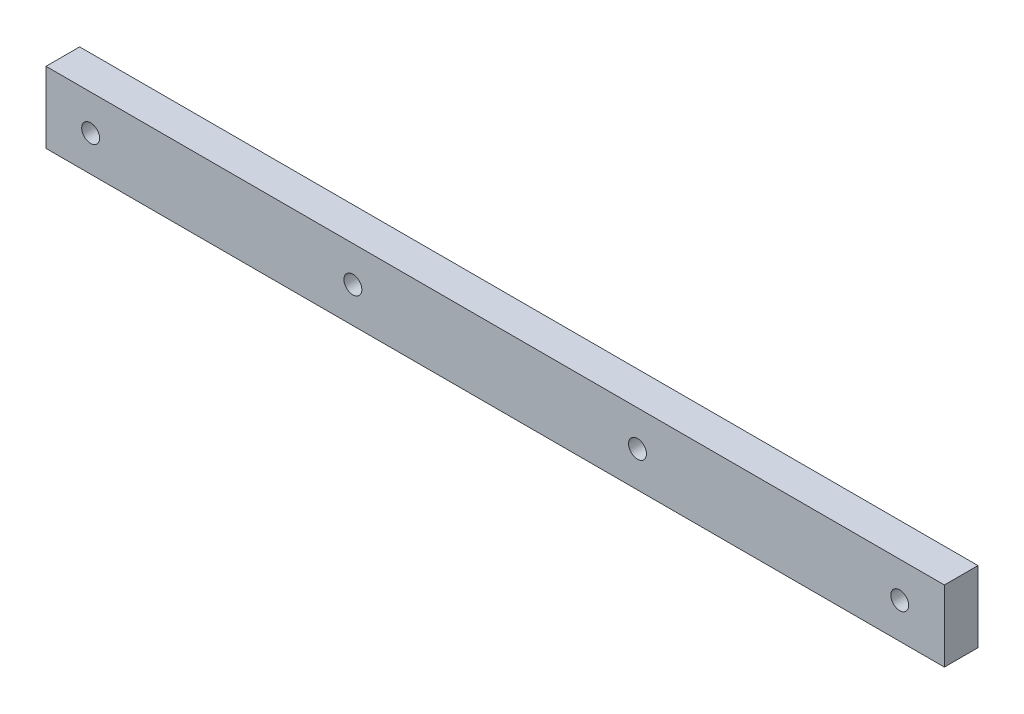
ISO-10303-21;
HEADER;
FILE_DESCRIPTION(('STEP AP214'),'2;1');
FILE_NAME('part.step','',(''),(''),'','','');
FILE_SCHEMA(('AUTOMOTIVE_DESIGN { 1 0 10303 214 1 1 1 1 }'));
ENDSEC;
DATA;
#1=APPLICATION_CONTEXT('core data for automotive mechanical design processes');
#2=APPLICATION_PROTOCOL_DEFINITION('international standard','automotive_design',2000,#1);
#3=PRODUCT_CONTEXT('',#1,'mechanical');
#4=PRODUCT('Part','Part','',(#3));
#5=PRODUCT_RELATED_PRODUCT_CATEGORY('part','',(#4));
#6=PRODUCT_DEFINITION_FORMATION('','',#4);
#7=PRODUCT_DEFINITION_CONTEXT('part definition',#1,'design');
#8=PRODUCT_DEFINITION('design','',#6,#7);
#9=PRODUCT_DEFINITION_SHAPE('','',#8);
#10=(LENGTH_UNIT() NAMED_UNIT(*) SI_UNIT(.MILLI.,.METRE.));
#11=(NAMED_UNIT(*) PLANE_ANGLE_UNIT() SI_UNIT($,.RADIAN.));
#12=(NAMED_UNIT(*) SI_UNIT($,.STERADIAN.) SOLID_ANGLE_UNIT());
#13=UNCERTAINTY_MEASURE_WITH_UNIT(LENGTH_MEASURE(1.E-05),#10,'distance_accuracy_value','');
#14=(GEOMETRIC_REPRESENTATION_CONTEXT(3) GLOBAL_UNCERTAINTY_ASSIGNED_CONTEXT((#13)) GLOBAL_UNIT_ASSIGNED_CONTEXT((#10,
#11,#12)) REPRESENTATION_CONTEXT('',''));
#15=CARTESIAN_POINT('',(0.,0.,0.));
#16=DIRECTION('',(0.,0.,1.));
#17=DIRECTION('',(1.,0.,0.));
#18=AXIS2_PLACEMENT_3D('',#15,#16,#17);
#19=CARTESIAN_POINT('',(0.,0.,6.));
#20=DIRECTION('',(0.,0.,1.));
#21=DIRECTION('',(1.,0.,0.));
#22=AXIS2_PLACEMENT_3D('',#19,#20,#21);
#23=PLANE('',#22);
#24=CARTESIAN_POINT('',(-25.4,6.35,6.));
#25=DIRECTION('',(0.,0.,1.));
#26=DIRECTION('',(1.,0.,0.));
#27=AXIS2_PLACEMENT_3D('',#24,#25,#26);
#28=CIRCLE('',#27,1.6);
#29=CARTESIAN_POINT('',(-23.8,6.35,6.));
#30=VERTEX_POINT('',#29);
#31=EDGE_CURVE('E130',#30,#30,#28,.T.);
#32=ORIENTED_EDGE('',*,*,#31,.F.);
#33=EDGE_LOOP('',(#32));
#34=FACE_BOUND('',#33,.T.);
#35=CARTESIAN_POINT('',(-72.2,6.35,6.));
#36=DIRECTION('',(0.,0.,1.));
#37=DIRECTION('',(1.,0.,0.));
#38=AXIS2_PLACEMENT_3D('',#35,#36,#37);
#39=CIRCLE('',#38,1.6);
#40=CARTESIAN_POINT('',(-70.6,6.35,6.));
#41=VERTEX_POINT('',#40);
#42=EDGE_CURVE('E106',#41,#41,#39,.T.);
#43=ORIENTED_EDGE('',*,*,#42,.F.);
#44=EDGE_LOOP('',(#43));
#45=FACE_BOUND('',#44,.T.);
#46=DIRECTION('',(0.,-1.,0.));
#47=VECTOR('',#46,1.);
#48=CARTESIAN_POINT('',(-80.17,12.7,6.));
#49=LINE('',#48,#47);
#50=CARTESIAN_POINT('',(-80.17,12.7,6.));
#51=VERTEX_POINT('',#50);
#52=CARTESIAN_POINT('',(-80.17,0.,6.));
#53=VERTEX_POINT('',#52);
#54=EDGE_CURVE('E93',#51,#53,#49,.T.);
#55=ORIENTED_EDGE('',*,*,#54,.T.);
#56=DIRECTION('',(1.,0.,0.));
#57=VECTOR('',#56,1.);
#58=CARTESIAN_POINT('',(-80.17,0.,6.));
#59=LINE('',#58,#57);
#60=CARTESIAN_POINT('',(80.17,0.,6.));
#61=VERTEX_POINT('',#60);
#62=EDGE_CURVE('E88',#53,#61,#59,.T.);
#63=ORIENTED_EDGE('',*,*,#62,.T.);
#64=DIRECTION('',(0.,1.,0.));
#65=VECTOR('',#64,1.);
#66=CARTESIAN_POINT('',(80.17,0.,6.));
#67=LINE('',#66,#65);
#68=CARTESIAN_POINT('',(80.17,12.7,6.));
#69=VERTEX_POINT('',#68);
#70=EDGE_CURVE('E90',#61,#69,#67,.T.);
#71=ORIENTED_EDGE('',*,*,#70,.T.);
#72=DIRECTION('',(-1.,0.,0.));
#73=VECTOR('',#72,1.);
#74=CARTESIAN_POINT('',(80.17,12.7,6.));
#75=LINE('',#74,#73);
#76=EDGE_CURVE('E57',#69,#51,#75,.T.);
#77=ORIENTED_EDGE('',*,*,#76,.T.);
#78=EDGE_LOOP('',(#55,#63,#71,#77));
#79=FACE_BOUND('',#78,.T.);
#80=CARTESIAN_POINT('',(72.2,6.35,6.));
#81=DIRECTION('',(0.,0.,1.));
#82=DIRECTION('',(1.,0.,0.));
#83=AXIS2_PLACEMENT_3D('',#80,#81,#82);
#84=CIRCLE('',#83,1.6);
#85=CARTESIAN_POINT('',(73.8,6.35,6.));
#86=VERTEX_POINT('',#85);
#87=EDGE_CURVE('E121',#86,#86,#84,.T.);
#88=ORIENTED_EDGE('',*,*,#87,.F.);
#89=EDGE_LOOP('',(#88));
#90=FACE_BOUND('',#89,.T.);
#91=CARTESIAN_POINT('',(25.4,6.35,6.));
#92=DIRECTION('',(0.,0.,1.));
#93=DIRECTION('',(1.,0.,0.));
#94=AXIS2_PLACEMENT_3D('',#91,#92,#93);
#95=CIRCLE('',#94,1.6);
#96=CARTESIAN_POINT('',(27.,6.35,6.));
#97=VERTEX_POINT('',#96);
#98=EDGE_CURVE('E134',#97,#97,#95,.T.);
#99=ORIENTED_EDGE('',*,*,#98,.F.);
#100=EDGE_LOOP('',(#99));
#101=FACE_BOUND('',#100,.T.);
#102=ADVANCED_FACE('F39',(#34,#45,#79,#90,#101),#23,.T.);
#103=CARTESIAN_POINT('',(0.,0.,0.));
#104=DIRECTION('',(0.,0.,1.));
#105=DIRECTION('',(1.,0.,0.));
#106=AXIS2_PLACEMENT_3D('',#103,#104,#105);
#107=PLANE('',#106);
#108=DIRECTION('',(0.,-1.,0.));
#109=VECTOR('',#108,1.);
#110=CARTESIAN_POINT('',(-80.17,12.7,0.));
#111=LINE('',#110,#109);
#112=CARTESIAN_POINT('',(-80.17,12.7,0.));
#113=VERTEX_POINT('',#112);
#114=CARTESIAN_POINT('',(-80.17,0.,0.));
#115=VERTEX_POINT('',#114);
#116=EDGE_CURVE('E103',#113,#115,#111,.T.);
#117=ORIENTED_EDGE('',*,*,#116,.F.);
#118=DIRECTION('',(-1.,0.,0.));
#119=VECTOR('',#118,1.);
#120=CARTESIAN_POINT('',(80.17,12.7,0.));
#121=LINE('',#120,#119);
#122=CARTESIAN_POINT('',(80.17,12.7,0.));
#123=VERTEX_POINT('',#122);
#124=EDGE_CURVE('E76',#123,#113,#121,.T.);
#125=ORIENTED_EDGE('',*,*,#124,.F.);
#126=DIRECTION('',(0.,1.,0.));
#127=VECTOR('',#126,1.);
#128=CARTESIAN_POINT('',(80.17,0.,0.));
#129=LINE('',#128,#127);
#130=CARTESIAN_POINT('',(80.17,0.,0.));
#131=VERTEX_POINT('',#130);
#132=EDGE_CURVE('E71',#131,#123,#129,.T.);
#133=ORIENTED_EDGE('',*,*,#132,.F.);
#134=DIRECTION('',(1.,0.,0.));
#135=VECTOR('',#134,1.);
#136=CARTESIAN_POINT('',(-80.17,0.,0.));
#137=LINE('',#136,#135);
#138=EDGE_CURVE('E92',#115,#131,#137,.T.);
#139=ORIENTED_EDGE('',*,*,#138,.F.);
#140=EDGE_LOOP('',(#117,#125,#133,#139));
#141=FACE_BOUND('',#140,.T.);
#142=CARTESIAN_POINT('',(-72.2,6.35,0.));
#143=DIRECTION('',(0.,0.,1.));
#144=DIRECTION('',(1.,0.,0.));
#145=AXIS2_PLACEMENT_3D('',#142,#143,#144);
#146=CIRCLE('',#145,1.6);
#147=CARTESIAN_POINT('',(-70.6,6.35,0.));
#148=VERTEX_POINT('',#147);
#149=EDGE_CURVE('E119',#148,#148,#146,.T.);
#150=ORIENTED_EDGE('',*,*,#149,.T.);
#151=EDGE_LOOP('',(#150));
#152=FACE_BOUND('',#151,.T.);
#153=CARTESIAN_POINT('',(72.2,6.35,0.));
#154=DIRECTION('',(0.,0.,1.));
#155=DIRECTION('',(1.,0.,0.));
#156=AXIS2_PLACEMENT_3D('',#153,#154,#155);
#157=CIRCLE('',#156,1.6);
#158=CARTESIAN_POINT('',(73.8,6.35,0.));
#159=VERTEX_POINT('',#158);
#160=EDGE_CURVE('E123',#159,#159,#157,.T.);
#161=ORIENTED_EDGE('',*,*,#160,.T.);
#162=EDGE_LOOP('',(#161));
#163=FACE_BOUND('',#162,.T.);
#164=CARTESIAN_POINT('',(-25.4,6.35,0.));
#165=DIRECTION('',(0.,0.,1.));
#166=DIRECTION('',(1.,0.,0.));
#167=AXIS2_PLACEMENT_3D('',#164,#165,#166);
#168=CIRCLE('',#167,1.6);
#169=CARTESIAN_POINT('',(-23.8,6.35,0.));
#170=VERTEX_POINT('',#169);
#171=EDGE_CURVE('E128',#170,#170,#168,.T.);
#172=ORIENTED_EDGE('',*,*,#171,.T.);
#173=EDGE_LOOP('',(#172));
#174=FACE_BOUND('',#173,.T.);
#175=CARTESIAN_POINT('',(25.4,6.35,0.));
#176=DIRECTION('',(0.,0.,1.));
#177=DIRECTION('',(1.,0.,0.));
#178=AXIS2_PLACEMENT_3D('',#175,#176,#177);
#179=CIRCLE('',#178,1.6);
#180=CARTESIAN_POINT('',(27.,6.35,0.));
#181=VERTEX_POINT('',#180);
#182=EDGE_CURVE('E136',#181,#181,#179,.T.);
#183=ORIENTED_EDGE('',*,*,#182,.T.);
#184=EDGE_LOOP('',(#183));
#185=FACE_BOUND('',#184,.T.);
#186=ADVANCED_FACE('F111',(#141,#152,#163,#174,#185),#107,.F.);
#187=CARTESIAN_POINT('',(-80.17,12.7,6.));
#188=DIRECTION('',(1.,0.,0.));
#189=DIRECTION('',(0.,0.,-1.));
#190=AXIS2_PLACEMENT_3D('',#187,#188,#189);
#191=PLANE('',#190);
#192=ORIENTED_EDGE('',*,*,#116,.T.);
#193=DIRECTION('',(0.,0.,-1.));
#194=VECTOR('',#193,1.);
#195=CARTESIAN_POINT('',(-80.17,0.,6.));
#196=LINE('',#195,#194);
#197=EDGE_CURVE('E11',#53,#115,#196,.T.);
#198=ORIENTED_EDGE('',*,*,#197,.F.);
#199=ORIENTED_EDGE('',*,*,#54,.F.);
#200=DIRECTION('',(0.,0.,-1.));
#201=VECTOR('',#200,1.);
#202=CARTESIAN_POINT('',(-80.17,12.7,6.));
#203=LINE('',#202,#201);
#204=EDGE_CURVE('E97',#51,#113,#203,.T.);
#205=ORIENTED_EDGE('',*,*,#204,.T.);
#206=EDGE_LOOP('',(#192,#198,#199,#205));
#207=FACE_BOUND('',#206,.T.);
#208=ADVANCED_FACE('F41',(#207),#191,.F.);
#209=CARTESIAN_POINT('',(-80.17,0.,6.));
#210=DIRECTION('',(0.,1.,0.));
#211=DIRECTION('',(0.,0.,1.));
#212=AXIS2_PLACEMENT_3D('',#209,#210,#211);
#213=PLANE('',#212);
#214=ORIENTED_EDGE('',*,*,#138,.T.);
#215=DIRECTION('',(0.,0.,-1.));
#216=VECTOR('',#215,1.);
#217=CARTESIAN_POINT('',(80.17,0.,6.));
#218=LINE('',#217,#216);
#219=EDGE_CURVE('E48',#61,#131,#218,.T.);
#220=ORIENTED_EDGE('',*,*,#219,.F.);
#221=ORIENTED_EDGE('',*,*,#62,.F.);
#222=ORIENTED_EDGE('',*,*,#197,.T.);
#223=EDGE_LOOP('',(#214,#220,#221,#222));
#224=FACE_BOUND('',#223,.T.);
#225=ADVANCED_FACE('F94',(#224),#213,.F.);
#226=CARTESIAN_POINT('',(80.17,0.,6.));
#227=DIRECTION('',(-1.,0.,0.));
#228=DIRECTION('',(0.,0.,1.));
#229=AXIS2_PLACEMENT_3D('',#226,#227,#228);
#230=PLANE('',#229);
#231=ORIENTED_EDGE('',*,*,#132,.T.);
#232=DIRECTION('',(0.,0.,-1.));
#233=VECTOR('',#232,1.);
#234=CARTESIAN_POINT('',(80.17,12.7,6.));
#235=LINE('',#234,#233);
#236=EDGE_CURVE('E96',#69,#123,#235,.T.);
#237=ORIENTED_EDGE('',*,*,#236,.F.);
#238=ORIENTED_EDGE('',*,*,#70,.F.);
#239=ORIENTED_EDGE('',*,*,#219,.T.);
#240=EDGE_LOOP('',(#231,#237,#238,#239));
#241=FACE_BOUND('',#240,.T.);
#242=ADVANCED_FACE('F100',(#241),#230,.F.);
#243=CARTESIAN_POINT('',(80.17,12.7,6.));
#244=DIRECTION('',(0.,-1.,0.));
#245=DIRECTION('',(0.,0.,-1.));
#246=AXIS2_PLACEMENT_3D('',#243,#244,#245);
#247=PLANE('',#246);
#248=ORIENTED_EDGE('',*,*,#124,.T.);
#249=ORIENTED_EDGE('',*,*,#204,.F.);
#250=ORIENTED_EDGE('',*,*,#76,.F.);
#251=ORIENTED_EDGE('',*,*,#236,.T.);
#252=EDGE_LOOP('',(#248,#249,#250,#251));
#253=FACE_BOUND('',#252,.T.);
#254=ADVANCED_FACE('F112',(#253),#247,.F.);
#255=CARTESIAN_POINT('',(-72.2,6.35,6.));
#256=DIRECTION('',(0.,0.,-1.));
#257=DIRECTION('',(-1.,0.,0.));
#258=AXIS2_PLACEMENT_3D('',#255,#256,#257);
#259=CYLINDRICAL_SURFACE('',#258,1.6);
#260=ORIENTED_EDGE('',*,*,#42,.T.);
#261=EDGE_LOOP('',(#260));
#262=FACE_BOUND('',#261,.T.);
#263=ORIENTED_EDGE('',*,*,#149,.F.);
#264=EDGE_LOOP('',(#263));
#265=FACE_BOUND('',#264,.T.);
#266=ADVANCED_FACE('F154',(#262,#265),#259,.F.);
#267=CARTESIAN_POINT('',(72.2,6.35,6.));
#268=DIRECTION('',(0.,0.,-1.));
#269=DIRECTION('',(-1.,0.,0.));
#270=AXIS2_PLACEMENT_3D('',#267,#268,#269);
#271=CYLINDRICAL_SURFACE('',#270,1.6);
#272=ORIENTED_EDGE('',*,*,#87,.T.);
#273=EDGE_LOOP('',(#272));
#274=FACE_BOUND('',#273,.T.);
#275=ORIENTED_EDGE('',*,*,#160,.F.);
#276=EDGE_LOOP('',(#275));
#277=FACE_BOUND('',#276,.T.);
#278=ADVANCED_FACE('F199',(#274,#277),#271,.F.);
#279=CARTESIAN_POINT('',(-25.4,6.35,6.));
#280=DIRECTION('',(0.,0.,-1.));
#281=DIRECTION('',(-1.,0.,0.));
#282=AXIS2_PLACEMENT_3D('',#279,#280,#281);
#283=CYLINDRICAL_SURFACE('',#282,1.6);
#284=ORIENTED_EDGE('',*,*,#31,.T.);
#285=EDGE_LOOP('',(#284));
#286=FACE_BOUND('',#285,.T.);
#287=ORIENTED_EDGE('',*,*,#171,.F.);
#288=EDGE_LOOP('',(#287));
#289=FACE_BOUND('',#288,.T.);
#290=ADVANCED_FACE('F208',(#286,#289),#283,.F.);
#291=CARTESIAN_POINT('',(25.4,6.35,6.));
#292=DIRECTION('',(0.,0.,-1.));
#293=DIRECTION('',(-1.,0.,0.));
#294=AXIS2_PLACEMENT_3D('',#291,#292,#293);
#295=CYLINDRICAL_SURFACE('',#294,1.6);
#296=ORIENTED_EDGE('',*,*,#98,.T.);
#297=EDGE_LOOP('',(#296));
#298=FACE_BOUND('',#297,.T.);
#299=ORIENTED_EDGE('',*,*,#182,.F.);
#300=EDGE_LOOP('',(#299));
#301=FACE_BOUND('',#300,.T.);
#302=ADVANCED_FACE('F142',(#298,#301),#295,.F.);
#303=CLOSED_SHELL('',(#102,#186,#208,#225,#242,#254,#266,#278,#290,#302));
#304=MANIFOLD_SOLID_BREP('B2',#303);
#305=ADVANCED_BREP_SHAPE_REPRESENTATION('',(#18,#304),#14);
#306=SHAPE_DEFINITION_REPRESENTATION(#9,#305);
ENDSEC;
END-ISO-10303-21;
